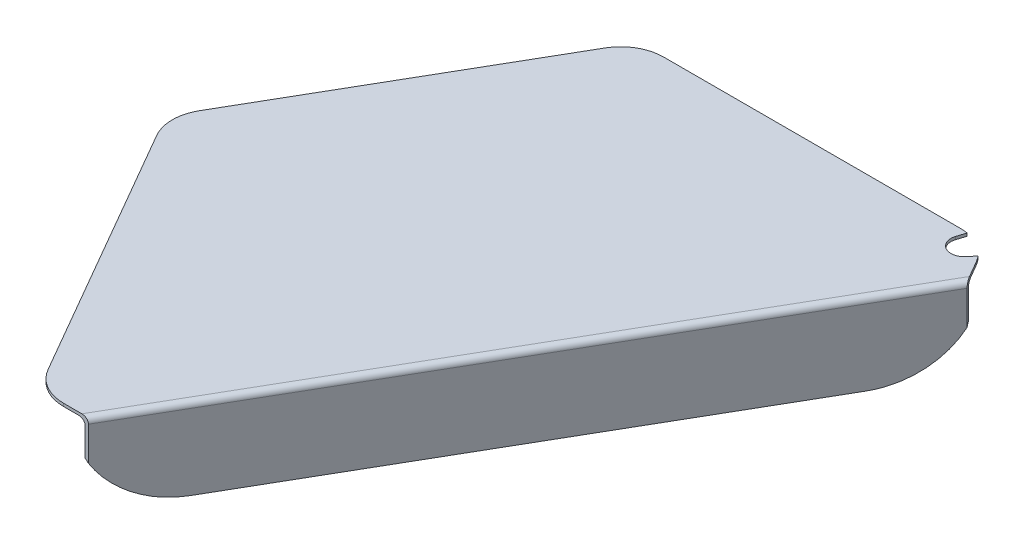
ISO-10303-21;
HEADER;
FILE_DESCRIPTION(('STEP AP214'),'2;1');
FILE_NAME('part.step','',(''),(''),'','','');
FILE_SCHEMA(('AUTOMOTIVE_DESIGN { 1 0 10303 214 1 1 1 1 }'));
ENDSEC;
DATA;
#1=APPLICATION_CONTEXT('core data for automotive mechanical design processes');
#2=APPLICATION_PROTOCOL_DEFINITION('international standard','automotive_design',2000,#1);
#3=PRODUCT_CONTEXT('',#1,'mechanical');
#4=PRODUCT('Part','Part','',(#3));
#5=PRODUCT_RELATED_PRODUCT_CATEGORY('part','',(#4));
#6=PRODUCT_DEFINITION_FORMATION('','',#4);
#7=PRODUCT_DEFINITION_CONTEXT('part definition',#1,'design');
#8=PRODUCT_DEFINITION('design','',#6,#7);
#9=PRODUCT_DEFINITION_SHAPE('','',#8);
#10=(LENGTH_UNIT() NAMED_UNIT(*) SI_UNIT(.MILLI.,.METRE.));
#11=(NAMED_UNIT(*) PLANE_ANGLE_UNIT() SI_UNIT($,.RADIAN.));
#12=(NAMED_UNIT(*) SI_UNIT($,.STERADIAN.) SOLID_ANGLE_UNIT());
#13=UNCERTAINTY_MEASURE_WITH_UNIT(LENGTH_MEASURE(1.E-05),#10,'distance_accuracy_value','');
#14=(GEOMETRIC_REPRESENTATION_CONTEXT(3) GLOBAL_UNCERTAINTY_ASSIGNED_CONTEXT((#13)) GLOBAL_UNIT_ASSIGNED_CONTEXT((#10,
#11,#12)) REPRESENTATION_CONTEXT('',''));
#15=CARTESIAN_POINT('',(0.,0.,0.));
#16=DIRECTION('',(0.,0.,1.));
#17=DIRECTION('',(1.,0.,0.));
#18=AXIS2_PLACEMENT_3D('',#15,#16,#17);
#19=CARTESIAN_POINT('',(14.9387078959027,1.,8.62486702504461));
#20=DIRECTION('',(0.866025403784439,0.,0.5));
#21=DIRECTION('',(0.5,0.,-0.866025403784439));
#22=AXIS2_PLACEMENT_3D('',#19,#20,#21);
#23=PLANE('',#22);
#24=CARTESIAN_POINT('',(-28.4771738330698,2.57790699895552,83.8233800350263));
#25=DIRECTION('',(-0.866025403784439,0.,-0.5));
#26=DIRECTION('',(0.5,0.,-0.866025403784439));
#27=AXIS2_PLACEMENT_3D('',#24,#25,#26);
#28=ELLIPSE('',#27,30.3108891324553,30.);
#29=CARTESIAN_POINT('',(-28.4771738330698,-27.4220930010445,83.8233800350263));
#30=VERTEX_POINT('',#29);
#31=CARTESIAN_POINT('',(-41.4675548898364,-12.8744556101758,106.323380035026));
#32=VERTEX_POINT('',#31);
#33=EDGE_CURVE('E179',#30,#32,#28,.T.);
#34=ORIENTED_EDGE('',*,*,#33,.F.);
#35=DIRECTION('',(-0.5,0.,0.866025403784439));
#36=VECTOR('',#35,1.);
#37=CARTESIAN_POINT('',(58.1253665453741,-27.4220930010445,-66.1766199649737));
#38=LINE('',#37,#36);
#39=CARTESIAN_POINT('',(58.1253665453741,-27.4220930010445,-66.1766199649737));
#40=VERTEX_POINT('',#39);
#41=EDGE_CURVE('E174',#40,#30,#38,.T.);
#42=ORIENTED_EDGE('',*,*,#41,.F.);
#43=CARTESIAN_POINT('',(58.125366545374,2.57790699895552,-66.1766199649737));
#44=DIRECTION('',(-0.866025403784439,0.,-0.5));
#45=DIRECTION('',(-0.5,0.,0.866025403784439));
#46=AXIS2_PLACEMENT_3D('',#43,#44,#45);
#47=ELLIPSE('',#46,30.3108891324553,30.);
#48=CARTESIAN_POINT('',(71.1157476021406,-12.8744556101757,-88.6766199649738));
#49=VERTEX_POINT('',#48);
#50=EDGE_CURVE('E182',#49,#40,#47,.T.);
#51=ORIENTED_EDGE('',*,*,#50,.F.);
#52=DIRECTION('',(0.,-1.,0.));
#53=VECTOR('',#52,1.);
#54=CARTESIAN_POINT('',(71.1157476021407,1.,-88.6766199649737));
#55=LINE('',#54,#53);
#56=CARTESIAN_POINT('',(71.1157476021407,-1.,-88.6766199649737));
#57=VERTEX_POINT('',#56);
#58=EDGE_CURVE('E313',#57,#49,#55,.T.);
#59=ORIENTED_EDGE('',*,*,#58,.F.);
#60=DIRECTION('',(-0.5,0.,0.866025403784439));
#61=VECTOR('',#60,1.);
#62=CARTESIAN_POINT('',(14.9387078959027,-1.,8.62486702504461));
#63=LINE('',#62,#61);
#64=CARTESIAN_POINT('',(-41.4675548898364,-1.,106.323380035026));
#65=VERTEX_POINT('',#64);
#66=EDGE_CURVE('E293',#57,#65,#63,.T.);
#67=ORIENTED_EDGE('',*,*,#66,.T.);
#68=DIRECTION('',(0.,-1.,0.));
#69=VECTOR('',#68,1.);
#70=CARTESIAN_POINT('',(-41.4675548898364,1.,106.323380035026));
#71=LINE('',#70,#69);
#72=EDGE_CURVE('E314',#65,#32,#71,.T.);
#73=ORIENTED_EDGE('',*,*,#72,.T.);
#74=EDGE_LOOP('',(#34,#42,#51,#59,#67,#73));
#75=FACE_BOUND('',#74,.T.);
#76=ADVANCED_FACE('F35',(#75),#23,.T.);
#77=CARTESIAN_POINT('',(14.0726824921183,-27.5,8.12486702504465));
#78=DIRECTION('',(0.866025403784439,0.,0.5));
#79=DIRECTION('',(0.5,0.,-0.866025403784439));
#80=AXIS2_PLACEMENT_3D('',#77,#78,#79);
#81=PLANE('',#80);
#82=DIRECTION('',(-0.5,0.,0.866025403784439));
#83=VECTOR('',#82,1.);
#84=CARTESIAN_POINT('',(14.0726824921183,-27.4220930010445,8.12486702504465));
#85=LINE('',#84,#83);
#86=CARTESIAN_POINT('',(57.2593411415897,-27.4220930010445,-66.6766199649737));
#87=VERTEX_POINT('',#86);
#88=CARTESIAN_POINT('',(-29.3431992368542,-27.4220930010445,83.3233800350263));
#89=VERTEX_POINT('',#88);
#90=EDGE_CURVE('E43',#87,#89,#85,.T.);
#91=ORIENTED_EDGE('',*,*,#90,.T.);
#92=CARTESIAN_POINT('',(-29.3431992368542,2.57790699895552,83.3233800350263));
#93=DIRECTION('',(-0.866025403784439,0.,-0.5));
#94=DIRECTION('',(0.5,0.,-0.866025403784439));
#95=AXIS2_PLACEMENT_3D('',#92,#93,#94);
#96=ELLIPSE('',#95,30.3108891324553,30.);
#97=CARTESIAN_POINT('',(-42.6222554282156,-11.8810426340501,106.323380035026));
#98=VERTEX_POINT('',#97);
#99=EDGE_CURVE('E11',#89,#98,#96,.T.);
#100=ORIENTED_EDGE('',*,*,#99,.T.);
#101=DIRECTION('',(0.,1.,0.));
#102=VECTOR('',#101,1.);
#103=CARTESIAN_POINT('',(-42.6222554282156,-27.5,106.323380035026));
#104=LINE('',#103,#102);
#105=CARTESIAN_POINT('',(-42.6222554282156,-2.,106.323380035026));
#106=VERTEX_POINT('',#105);
#107=EDGE_CURVE('E368',#98,#106,#104,.T.);
#108=ORIENTED_EDGE('',*,*,#107,.T.);
#109=DIRECTION('',(0.5,0.,-0.866025403784439));
#110=VECTOR('',#109,1.);
#111=CARTESIAN_POINT('',(70.5383973329511,-2.,-89.6766199649736));
#112=LINE('',#111,#110);
#113=CARTESIAN_POINT('',(70.5383973329511,-2.,-89.6766199649736));
#114=VERTEX_POINT('',#113);
#115=EDGE_CURVE('E295',#106,#114,#112,.T.);
#116=ORIENTED_EDGE('',*,*,#115,.T.);
#117=DIRECTION('',(0.,1.,0.));
#118=VECTOR('',#117,1.);
#119=CARTESIAN_POINT('',(70.5383973329511,-27.5,-89.6766199649736));
#120=LINE('',#119,#118);
#121=CARTESIAN_POINT('',(70.5383973329511,-11.8810426340502,-89.6766199649736));
#122=VERTEX_POINT('',#121);
#123=EDGE_CURVE('E312',#122,#114,#120,.T.);
#124=ORIENTED_EDGE('',*,*,#123,.F.);
#125=CARTESIAN_POINT('',(57.2593411415897,2.57790699895552,-66.6766199649737));
#126=DIRECTION('',(-0.866025403784439,0.,-0.5));
#127=DIRECTION('',(-0.5,0.,0.866025403784439));
#128=AXIS2_PLACEMENT_3D('',#125,#126,#127);
#129=ELLIPSE('',#128,30.3108891324553,30.);
#130=EDGE_CURVE('E309',#122,#87,#129,.T.);
#131=ORIENTED_EDGE('',*,*,#130,.T.);
#132=EDGE_LOOP('',(#91,#100,#108,#116,#124,#131));
#133=FACE_BOUND('',#132,.T.);
#134=ADVANCED_FACE('F221',(#133),#81,.F.);
#135=CARTESIAN_POINT('',(0.,0.,0.));
#136=DIRECTION('',(0.,1.,0.));
#137=DIRECTION('',(0.,0.,1.));
#138=AXIS2_PLACEMENT_3D('',#135,#136,#137);
#139=PLANE('',#138);
#140=DIRECTION('',(-0.499999999999998,0.,-0.86602540378444));
#141=VECTOR('',#140,1.);
#142=CARTESIAN_POINT('',(91.7349135073083,0.,-52.9631770075312));
#143=LINE('',#142,#141);
#144=CARTESIAN_POINT('',(69.3836967945718,0.,-91.6766199649737));
#145=VERTEX_POINT('',#144);
#146=CARTESIAN_POINT('',(66.7856205832185,0.,-96.1766199649737));
#147=VERTEX_POINT('',#146);
#148=EDGE_CURVE('E394',#145,#147,#143,.T.);
#149=ORIENTED_EDGE('',*,*,#148,.F.);
#150=DIRECTION('',(0.5,0.,-0.866025403784439));
#151=VECTOR('',#150,1.);
#152=CARTESIAN_POINT('',(-44.3543062357845,0.,105.323380035026));
#153=LINE('',#152,#151);
#154=CARTESIAN_POINT('',(-44.9316565049741,0.,106.323380035026));
#155=VERTEX_POINT('',#154);
#156=EDGE_CURVE('E298',#145,#155,#153,.F.);
#157=ORIENTED_EDGE('',*,*,#156,.T.);
#158=DIRECTION('',(-1.,0.,0.));
#159=VECTOR('',#158,1.);
#160=CARTESIAN_POINT('',(-3.40759820829226E-13,0.,106.323380035026));
#161=LINE('',#160,#159);
#162=CARTESIAN_POINT('',(-50.1278089276807,0.,106.323380035026));
#163=VERTEX_POINT('',#162);
#164=EDGE_CURVE('E392',#155,#163,#161,.T.);
#165=ORIENTED_EDGE('',*,*,#164,.T.);
#166=CARTESIAN_POINT('',(-50.1278089276807,0.,91.3233800350263));
#167=DIRECTION('',(0.,1.,0.));
#168=DIRECTION('',(0.,0.,1.));
#169=AXIS2_PLACEMENT_3D('',#166,#167,#168);
#170=CIRCLE('',#169,15.);
#171=CARTESIAN_POINT('',(-63.1181899844473,0.,98.8233800350262));
#172=VERTEX_POINT('',#171);
#173=EDGE_CURVE('E389',#172,#163,#170,.T.);
#174=ORIENTED_EDGE('',*,*,#173,.F.);
#175=DIRECTION('',(-0.5,0.,-0.866025403784439));
#176=VECTOR('',#175,1.);
#177=CARTESIAN_POINT('',(-90.1304212874238,0.,52.0368229924685));
#178=LINE('',#177,#176);
#179=CARTESIAN_POINT('',(-115.079714211514,0.,8.82338003502639));
#180=VERTEX_POINT('',#179);
#181=EDGE_CURVE('E386',#172,#180,#178,.T.);
#182=ORIENTED_EDGE('',*,*,#181,.T.);
#183=CARTESIAN_POINT('',(-102.089333154747,0.,1.32338003502633));
#184=DIRECTION('',(0.,1.,0.));
#185=DIRECTION('',(0.,0.,1.));
#186=AXIS2_PLACEMENT_3D('',#183,#184,#185);
#187=CIRCLE('',#186,15.);
#188=CARTESIAN_POINT('',(-115.079714211514,0.,-6.17661996497375));
#189=VERTEX_POINT('',#188);
#190=EDGE_CURVE('E383',#189,#180,#187,.T.);
#191=ORIENTED_EDGE('',*,*,#190,.F.);
#192=DIRECTION('',(0.5,0.,-0.866025403784439));
#193=VECTOR('',#192,1.);
#194=CARTESIAN_POINT('',(-88.9843405582299,0.,-51.3751329749554));
#195=LINE('',#194,#193);
#196=CARTESIAN_POINT('',(-63.1181899844474,0.,-96.1766199649736));
#197=VERTEX_POINT('',#196);
#198=EDGE_CURVE('E380',#189,#197,#195,.T.);
#199=ORIENTED_EDGE('',*,*,#198,.T.);
#200=CARTESIAN_POINT('',(-50.1278089276807,0.,-88.6766199649737));
#201=DIRECTION('',(0.,1.,0.));
#202=DIRECTION('',(0.,0.,1.));
#203=AXIS2_PLACEMENT_3D('',#200,#201,#202);
#204=CIRCLE('',#203,15.);
#205=CARTESIAN_POINT('',(-50.1278089276806,0.,-103.676619964974));
#206=VERTEX_POINT('',#205);
#207=EDGE_CURVE('E377',#206,#197,#204,.T.);
#208=ORIENTED_EDGE('',*,*,#207,.F.);
#209=DIRECTION('',(1.,0.,0.));
#210=VECTOR('',#209,1.);
#211=CARTESIAN_POINT('',(0.,0.,-103.676619964974));
#212=LINE('',#211,#210);
#213=CARTESIAN_POINT('',(53.7952395264518,0.,-103.676619964974));
#214=VERTEX_POINT('',#213);
#215=EDGE_CURVE('E374',#206,#214,#212,.T.);
#216=ORIENTED_EDGE('',*,*,#215,.T.);
#217=CARTESIAN_POINT('',(53.7952395264519,0.,-88.6766199649737));
#218=DIRECTION('',(0.,1.,0.));
#219=DIRECTION('',(0.,0.,1.));
#220=AXIS2_PLACEMENT_3D('',#217,#218,#219);
#221=CIRCLE('',#220,15.);
#222=CARTESIAN_POINT('',(56.3584015291872,0.,-103.456004273792));
#223=VERTEX_POINT('',#222);
#224=EDGE_CURVE('E371',#223,#214,#221,.T.);
#225=ORIENTED_EDGE('',*,*,#224,.F.);
#226=DIRECTION('',(-0.306743268264024,0.,0.951792292138734));
#227=VECTOR('',#226,1.);
#228=CARTESIAN_POINT('',(20.8509701854141,0.,6.71984296781569));
#229=LINE('',#228,#227);
#230=CARTESIAN_POINT('',(55.3768924535536,0.,-100.410484226557));
#231=VERTEX_POINT('',#230);
#232=EDGE_CURVE('E367',#223,#231,#229,.T.);
#233=ORIENTED_EDGE('',*,*,#232,.T.);
#234=CARTESIAN_POINT('',(59.7551369973918,0.,-98.9994651925429));
#235=DIRECTION('',(0.,1.,0.));
#236=DIRECTION('',(0.,0.,1.));
#237=AXIS2_PLACEMENT_3D('',#234,#235,#236);
#238=CIRCLE('',#237,4.60000000000001);
#239=CARTESIAN_POINT('',(63.4142519508294,0.,-96.2118357771562));
#240=VERTEX_POINT('',#239);
#241=EDGE_CURVE('E364',#231,#240,#238,.T.);
#242=ORIENTED_EDGE('',*,*,#241,.T.);
#243=DIRECTION('',(0.646175348146152,0.,-0.763188980166905));
#244=VECTOR('',#243,1.);
#245=CARTESIAN_POINT('',(-10.5111409694199,0.,-8.89955221030941));
#246=LINE('',#245,#244);
#247=CARTESIAN_POINT('',(65.2419807269817,0.,-98.370541559875));
#248=VERTEX_POINT('',#247);
#249=EDGE_CURVE('E399',#240,#248,#246,.T.);
#250=ORIENTED_EDGE('',*,*,#249,.T.);
#251=CARTESIAN_POINT('',(53.7952395264519,0.,-88.6766199649737));
#252=DIRECTION('',(0.,1.,0.));
#253=DIRECTION('',(0.,0.,1.));
#254=AXIS2_PLACEMENT_3D('',#251,#252,#253);
#255=CIRCLE('',#254,15.);
#256=EDGE_CURVE('E396',#147,#248,#255,.T.);
#257=ORIENTED_EDGE('',*,*,#256,.F.);
#258=EDGE_LOOP('',(#149,#157,#165,#174,#182,#191,#199,#208,#216,#225,#233,#242,#250,#257));
#259=FACE_BOUND('',#258,.T.);
#260=ADVANCED_FACE('F234',(#259),#139,.F.);
#261=CARTESIAN_POINT('',(59.7551369973918,1.,-98.9994651925429));
#262=DIRECTION('',(0.,-1.,0.));
#263=DIRECTION('',(0.,0.,-1.));
#264=AXIS2_PLACEMENT_3D('',#261,#262,#263);
#265=CYLINDRICAL_SURFACE('',#264,4.60000000000001);
#266=ORIENTED_EDGE('',*,*,#241,.F.);
#267=DIRECTION('',(0.,-1.,0.));
#268=VECTOR('',#267,1.);
#269=CARTESIAN_POINT('',(55.3768924535536,1.,-100.410484226557));
#270=LINE('',#269,#268);
#271=CARTESIAN_POINT('',(55.3768924535536,1.,-100.410484226557));
#272=VERTEX_POINT('',#271);
#273=EDGE_CURVE('E340',#272,#231,#270,.T.);
#274=ORIENTED_EDGE('',*,*,#273,.F.);
#275=CARTESIAN_POINT('',(59.7551369973918,1.,-98.9994651925429));
#276=DIRECTION('',(0.,1.,0.));
#277=DIRECTION('',(0.,0.,1.));
#278=AXIS2_PLACEMENT_3D('',#275,#276,#277);
#279=CIRCLE('',#278,4.60000000000001);
#280=CARTESIAN_POINT('',(63.4142519508294,1.,-96.2118357771562));
#281=VERTEX_POINT('',#280);
#282=EDGE_CURVE('E402',#272,#281,#279,.T.);
#283=ORIENTED_EDGE('',*,*,#282,.T.);
#284=DIRECTION('',(0.,-1.,0.));
#285=VECTOR('',#284,1.);
#286=CARTESIAN_POINT('',(63.4142519508294,1.,-96.2118357771562));
#287=LINE('',#286,#285);
#288=EDGE_CURVE('E363',#281,#240,#287,.T.);
#289=ORIENTED_EDGE('',*,*,#288,.T.);
#290=EDGE_LOOP('',(#266,#274,#283,#289));
#291=FACE_BOUND('',#290,.T.);
#292=ADVANCED_FACE('F272',(#291),#265,.F.);
#293=CARTESIAN_POINT('',(20.8509701854141,1.,6.71984296781569));
#294=DIRECTION('',(0.951792292138734,0.,0.306743268264024));
#295=DIRECTION('',(0.306743268264024,0.,-0.951792292138734));
#296=AXIS2_PLACEMENT_3D('',#293,#294,#295);
#297=PLANE('',#296);
#298=ORIENTED_EDGE('',*,*,#232,.F.);
#299=DIRECTION('',(0.,-1.,0.));
#300=VECTOR('',#299,1.);
#301=CARTESIAN_POINT('',(56.3584015291872,1.,-103.456004273792));
#302=LINE('',#301,#300);
#303=CARTESIAN_POINT('',(56.3584015291872,1.,-103.456004273792));
#304=VERTEX_POINT('',#303);
#305=EDGE_CURVE('E338',#304,#223,#302,.T.);
#306=ORIENTED_EDGE('',*,*,#305,.F.);
#307=DIRECTION('',(-0.306743268264024,0.,0.951792292138734));
#308=VECTOR('',#307,1.);
#309=CARTESIAN_POINT('',(20.8509701854141,1.,6.71984296781569));
#310=LINE('',#309,#308);
#311=EDGE_CURVE('E420',#304,#272,#310,.T.);
#312=ORIENTED_EDGE('',*,*,#311,.T.);
#313=ORIENTED_EDGE('',*,*,#273,.T.);
#314=EDGE_LOOP('',(#298,#306,#312,#313));
#315=FACE_BOUND('',#314,.T.);
#316=ADVANCED_FACE('F268',(#315),#297,.T.);
#317=CARTESIAN_POINT('',(53.7952395264519,1.,-88.6766199649737));
#318=DIRECTION('',(0.,-1.,0.));
#319=DIRECTION('',(0.,0.,-1.));
#320=AXIS2_PLACEMENT_3D('',#317,#318,#319);
#321=CYLINDRICAL_SURFACE('',#320,15.);
#322=ORIENTED_EDGE('',*,*,#224,.T.);
#323=DIRECTION('',(0.,-1.,0.));
#324=VECTOR('',#323,1.);
#325=CARTESIAN_POINT('',(53.7952395264518,1.,-103.676619964974));
#326=LINE('',#325,#324);
#327=CARTESIAN_POINT('',(53.7952395264518,1.,-103.676619964974));
#328=VERTEX_POINT('',#327);
#329=EDGE_CURVE('E336',#328,#214,#326,.T.);
#330=ORIENTED_EDGE('',*,*,#329,.F.);
#331=CARTESIAN_POINT('',(53.7952395264519,1.,-88.6766199649737));
#332=DIRECTION('',(0.,1.,0.));
#333=DIRECTION('',(0.,0.,1.));
#334=AXIS2_PLACEMENT_3D('',#331,#332,#333);
#335=CIRCLE('',#334,15.);
#336=EDGE_CURVE('E445',#304,#328,#335,.T.);
#337=ORIENTED_EDGE('',*,*,#336,.F.);
#338=ORIENTED_EDGE('',*,*,#305,.T.);
#339=EDGE_LOOP('',(#322,#330,#337,#338));
#340=FACE_BOUND('',#339,.T.);
#341=ADVANCED_FACE('F264',(#340),#321,.T.);
#342=CARTESIAN_POINT('',(0.,1.,-103.676619964974));
#343=DIRECTION('',(0.,0.,-1.));
#344=DIRECTION('',(-1.,0.,0.));
#345=AXIS2_PLACEMENT_3D('',#342,#343,#344);
#346=PLANE('',#345);
#347=ORIENTED_EDGE('',*,*,#215,.F.);
#348=DIRECTION('',(0.,-1.,0.));
#349=VECTOR('',#348,1.);
#350=CARTESIAN_POINT('',(-50.1278089276806,1.,-103.676619964974));
#351=LINE('',#350,#349);
#352=CARTESIAN_POINT('',(-50.1278089276806,1.,-103.676619964974));
#353=VERTEX_POINT('',#352);
#354=EDGE_CURVE('E334',#353,#206,#351,.T.);
#355=ORIENTED_EDGE('',*,*,#354,.F.);
#356=DIRECTION('',(1.,0.,0.));
#357=VECTOR('',#356,1.);
#358=CARTESIAN_POINT('',(0.,1.,-103.676619964974));
#359=LINE('',#358,#357);
#360=EDGE_CURVE('E443',#353,#328,#359,.T.);
#361=ORIENTED_EDGE('',*,*,#360,.T.);
#362=ORIENTED_EDGE('',*,*,#329,.T.);
#363=EDGE_LOOP('',(#347,#355,#361,#362));
#364=FACE_BOUND('',#363,.T.);
#365=ADVANCED_FACE('F260',(#364),#346,.T.);
#366=CARTESIAN_POINT('',(-50.1278089276807,1.,-88.6766199649737));
#367=DIRECTION('',(0.,-1.,0.));
#368=DIRECTION('',(0.,0.,-1.));
#369=AXIS2_PLACEMENT_3D('',#366,#367,#368);
#370=CYLINDRICAL_SURFACE('',#369,15.);
#371=ORIENTED_EDGE('',*,*,#207,.T.);
#372=DIRECTION('',(0.,-1.,0.));
#373=VECTOR('',#372,1.);
#374=CARTESIAN_POINT('',(-63.1181899844474,1.,-96.1766199649736));
#375=LINE('',#374,#373);
#376=CARTESIAN_POINT('',(-63.1181899844474,1.,-96.1766199649736));
#377=VERTEX_POINT('',#376);
#378=EDGE_CURVE('E332',#377,#197,#375,.T.);
#379=ORIENTED_EDGE('',*,*,#378,.F.);
#380=CARTESIAN_POINT('',(-50.1278089276807,1.,-88.6766199649737));
#381=DIRECTION('',(0.,1.,0.));
#382=DIRECTION('',(0.,0.,1.));
#383=AXIS2_PLACEMENT_3D('',#380,#381,#382);
#384=CIRCLE('',#383,15.);
#385=EDGE_CURVE('E451',#353,#377,#384,.T.);
#386=ORIENTED_EDGE('',*,*,#385,.F.);
#387=ORIENTED_EDGE('',*,*,#354,.T.);
#388=EDGE_LOOP('',(#371,#379,#386,#387));
#389=FACE_BOUND('',#388,.T.);
#390=ADVANCED_FACE('F256',(#389),#370,.T.);
#391=CARTESIAN_POINT('',(-88.9843405582299,1.,-51.3751329749554));
#392=DIRECTION('',(-0.866025403784439,0.,-0.5));
#393=DIRECTION('',(-0.5,0.,0.866025403784439));
#394=AXIS2_PLACEMENT_3D('',#391,#392,#393);
#395=PLANE('',#394);
#396=ORIENTED_EDGE('',*,*,#198,.F.);
#397=DIRECTION('',(0.,-1.,0.));
#398=VECTOR('',#397,1.);
#399=CARTESIAN_POINT('',(-115.079714211514,1.,-6.17661996497375));
#400=LINE('',#399,#398);
#401=CARTESIAN_POINT('',(-115.079714211514,1.,-6.17661996497375));
#402=VERTEX_POINT('',#401);
#403=EDGE_CURVE('E330',#402,#189,#400,.T.);
#404=ORIENTED_EDGE('',*,*,#403,.F.);
#405=DIRECTION('',(0.5,0.,-0.866025403784439));
#406=VECTOR('',#405,1.);
#407=CARTESIAN_POINT('',(-88.9843405582299,1.,-51.3751329749554));
#408=LINE('',#407,#406);
#409=EDGE_CURVE('E437',#402,#377,#408,.T.);
#410=ORIENTED_EDGE('',*,*,#409,.T.);
#411=ORIENTED_EDGE('',*,*,#378,.T.);
#412=EDGE_LOOP('',(#396,#404,#410,#411));
#413=FACE_BOUND('',#412,.T.);
#414=ADVANCED_FACE('F252',(#413),#395,.T.);
#415=CARTESIAN_POINT('',(-102.089333154747,1.,1.32338003502633));
#416=DIRECTION('',(0.,-1.,0.));
#417=DIRECTION('',(0.,0.,-1.));
#418=AXIS2_PLACEMENT_3D('',#415,#416,#417);
#419=CYLINDRICAL_SURFACE('',#418,15.);
#420=ORIENTED_EDGE('',*,*,#190,.T.);
#421=DIRECTION('',(0.,-1.,0.));
#422=VECTOR('',#421,1.);
#423=CARTESIAN_POINT('',(-115.079714211514,1.,8.82338003502639));
#424=LINE('',#423,#422);
#425=CARTESIAN_POINT('',(-115.079714211514,1.,8.82338003502639));
#426=VERTEX_POINT('',#425);
#427=EDGE_CURVE('E328',#426,#180,#424,.T.);
#428=ORIENTED_EDGE('',*,*,#427,.F.);
#429=CARTESIAN_POINT('',(-102.089333154747,1.,1.32338003502633));
#430=DIRECTION('',(0.,1.,0.));
#431=DIRECTION('',(0.,0.,1.));
#432=AXIS2_PLACEMENT_3D('',#429,#430,#431);
#433=CIRCLE('',#432,15.);
#434=EDGE_CURVE('E454',#402,#426,#433,.T.);
#435=ORIENTED_EDGE('',*,*,#434,.F.);
#436=ORIENTED_EDGE('',*,*,#403,.T.);
#437=EDGE_LOOP('',(#420,#428,#435,#436));
#438=FACE_BOUND('',#437,.T.);
#439=ADVANCED_FACE('F248',(#438),#419,.T.);
#440=CARTESIAN_POINT('',(-90.1304212874238,1.,52.0368229924685));
#441=DIRECTION('',(-0.866025403784439,0.,0.5));
#442=DIRECTION('',(0.5,0.,0.866025403784439));
#443=AXIS2_PLACEMENT_3D('',#440,#441,#442);
#444=PLANE('',#443);
#445=ORIENTED_EDGE('',*,*,#181,.F.);
#446=DIRECTION('',(0.,-1.,0.));
#447=VECTOR('',#446,1.);
#448=CARTESIAN_POINT('',(-63.1181899844473,1.,98.8233800350262));
#449=LINE('',#448,#447);
#450=CARTESIAN_POINT('',(-63.1181899844473,1.,98.8233800350262));
#451=VERTEX_POINT('',#450);
#452=EDGE_CURVE('E326',#451,#172,#449,.T.);
#453=ORIENTED_EDGE('',*,*,#452,.F.);
#454=DIRECTION('',(-0.5,0.,-0.866025403784439));
#455=VECTOR('',#454,1.);
#456=CARTESIAN_POINT('',(-90.1304212874238,1.,52.0368229924685));
#457=LINE('',#456,#455);
#458=EDGE_CURVE('E355',#451,#426,#457,.T.);
#459=ORIENTED_EDGE('',*,*,#458,.T.);
#460=ORIENTED_EDGE('',*,*,#427,.T.);
#461=EDGE_LOOP('',(#445,#453,#459,#460));
#462=FACE_BOUND('',#461,.T.);
#463=ADVANCED_FACE('F244',(#462),#444,.T.);
#464=CARTESIAN_POINT('',(-50.1278089276807,1.,91.3233800350263));
#465=DIRECTION('',(0.,-1.,0.));
#466=DIRECTION('',(0.,0.,-1.));
#467=AXIS2_PLACEMENT_3D('',#464,#465,#466);
#468=CYLINDRICAL_SURFACE('',#467,15.);
#469=ORIENTED_EDGE('',*,*,#173,.T.);
#470=DIRECTION('',(0.,-1.,0.));
#471=VECTOR('',#470,1.);
#472=CARTESIAN_POINT('',(-50.1278089276807,1.,106.323380035026));
#473=LINE('',#472,#471);
#474=CARTESIAN_POINT('',(-50.1278089276807,1.,106.323380035026));
#475=VERTEX_POINT('',#474);
#476=EDGE_CURVE('E317',#475,#163,#473,.T.);
#477=ORIENTED_EDGE('',*,*,#476,.F.);
#478=CARTESIAN_POINT('',(-50.1278089276807,1.,91.3233800350263));
#479=DIRECTION('',(0.,1.,0.));
#480=DIRECTION('',(0.,0.,1.));
#481=AXIS2_PLACEMENT_3D('',#478,#479,#480);
#482=CIRCLE('',#481,15.);
#483=EDGE_CURVE('E349',#451,#475,#482,.T.);
#484=ORIENTED_EDGE('',*,*,#483,.F.);
#485=ORIENTED_EDGE('',*,*,#452,.T.);
#486=EDGE_LOOP('',(#469,#477,#484,#485));
#487=FACE_BOUND('',#486,.T.);
#488=ADVANCED_FACE('F240',(#487),#468,.T.);
#489=CARTESIAN_POINT('',(-3.40759820829226E-13,1.,106.323380035026));
#490=DIRECTION('',(0.,0.,1.));
#491=DIRECTION('',(1.,0.,0.));
#492=AXIS2_PLACEMENT_3D('',#489,#490,#491);
#493=PLANE('',#492);
#494=CARTESIAN_POINT('',(-41.4675548898364,-12.8744556101758,106.323380035026));
#495=CARTESIAN_POINT('',(-41.5909436638115,-12.7728425027459,106.323380035026));
#496=CARTESIAN_POINT('',(-41.7136640831995,-12.670416444895,106.323380035026));
#497=CARTESIAN_POINT('',(-41.9576027947693,-12.464001133313,106.323380035026));
#498=CARTESIAN_POINT('',(-42.0788222826722,-12.3600132924891,106.323380035026));
#499=CARTESIAN_POINT('',(-42.3197239870312,-12.1504338641998,106.323380035026));
#500=CARTESIAN_POINT('',(-42.4394071837448,-12.044843403888,106.323380035026));
#501=CARTESIAN_POINT('',(-42.6771980856443,-11.8320156259822,106.323380035026));
#502=CARTESIAN_POINT('',(-42.7953065131628,-11.7247791156378,106.323380035026));
#503=CARTESIAN_POINT('',(-43.0299074404591,-11.5086133392108,106.323380035026));
#504=CARTESIAN_POINT('',(-43.1464003540899,-11.3996845224017,106.323380035026));
#505=CARTESIAN_POINT('',(-43.3777423593454,-11.1800707254097,106.323380035026));
#506=CARTESIAN_POINT('',(-43.4925912789386,-11.0693855639573,106.323380035026));
#507=CARTESIAN_POINT('',(-43.7205802625161,-10.8462241006085,106.323380035026));
#508=CARTESIAN_POINT('',(-43.8337199865188,-10.7337474512691,106.323380035026));
#509=CARTESIAN_POINT('',(-44.0582374944218,-10.506951368749,106.323380035026));
#510=CARTESIAN_POINT('',(-44.1696144870536,-10.3926311520376,106.323380035026));
#511=CARTESIAN_POINT('',(-44.3905503125849,-10.1620927924925,106.323380035026));
#512=CARTESIAN_POINT('',(-44.5001078189228,-10.0458733777654,106.323380035026));
#513=CARTESIAN_POINT('',(-44.717343532475,-9.81147818274895,106.323380035026));
#514=CARTESIAN_POINT('',(-44.8250197779022,-9.69330058458651,106.323380035026));
#515=CARTESIAN_POINT('',(-44.9316565049741,-9.57419032569399,106.323380035026));
#516=B_SPLINE_CURVE_WITH_KNOTS('',3,(#494,#495,#496,#497,#498,#499,#500,#501,#502,#503,#504,
#505,#506,#507,#508,#509,#510,#511,#512,#513,#514,#515),.UNSPECIFIED.,.F.,.F.,(4,2,2,2,2,2,2,2,
2,2,4),(0.,0.479528959567975,0.958647508452173,1.43744340910346,1.91601156145012,
2.39445476391931,2.87294767113911,3.35153453592694,3.83033046465839,4.30946137474963,
4.78906523077738),.UNSPECIFIED.);
#517=EDGE_CURVE('E203',#32,#98,#516,.T.);
#518=ORIENTED_EDGE('',*,*,#517,.F.);
#519=ORIENTED_EDGE('',*,*,#72,.F.);
#520=CARTESIAN_POINT('',(-43.7769559665949,-1.,106.323380035026));
#521=DIRECTION('',(0.,0.,1.));
#522=DIRECTION('',(-1.,0.,0.));
#523=AXIS2_PLACEMENT_3D('',#520,#521,#522);
#524=ELLIPSE('',#523,2.3094010767585,2.);
#525=CARTESIAN_POINT('',(-43.7769559665949,1.,106.323380035026));
#526=VERTEX_POINT('',#525);
#527=EDGE_CURVE('E300',#65,#526,#524,.T.);
#528=ORIENTED_EDGE('',*,*,#527,.T.);
#529=DIRECTION('',(-1.,0.,0.));
#530=VECTOR('',#529,1.);
#531=CARTESIAN_POINT('',(-3.40759820829226E-13,1.,106.323380035026));
#532=LINE('',#531,#530);
#533=EDGE_CURVE('E345',#526,#475,#532,.T.);
#534=ORIENTED_EDGE('',*,*,#533,.T.);
#535=ORIENTED_EDGE('',*,*,#476,.T.);
#536=ORIENTED_EDGE('',*,*,#164,.F.);
#537=CARTESIAN_POINT('',(-44.9316565049741,-2.,106.323380035026));
#538=DIRECTION('',(0.,0.,1.));
#539=DIRECTION('',(-1.,0.,0.));
#540=AXIS2_PLACEMENT_3D('',#537,#538,#539);
#541=ELLIPSE('',#540,2.3094010767585,2.);
#542=EDGE_CURVE('E306',#155,#106,#541,.F.);
#543=ORIENTED_EDGE('',*,*,#542,.T.);
#544=ORIENTED_EDGE('',*,*,#107,.F.);
#545=EDGE_LOOP('',(#518,#519,#528,#534,#535,#536,#543,#544));
#546=FACE_BOUND('',#545,.T.);
#547=ADVANCED_FACE('F236',(#546),#493,.T.);
#548=CARTESIAN_POINT('',(91.7349135073083,1.,-52.9631770075312));
#549=DIRECTION('',(-0.86602540378444,0.,0.499999999999998));
#550=DIRECTION('',(0.499999999999998,0.,0.86602540378444));
#551=AXIS2_PLACEMENT_3D('',#548,#549,#550);
#552=PLANE('',#551);
#553=ORIENTED_EDGE('',*,*,#58,.T.);
#554=CARTESIAN_POINT('',(71.1157476021407,-12.8744556101758,-88.6766199649737));
#555=CARTESIAN_POINT('',(71.0540532151531,-12.7728425027459,-88.783477777778));
#556=CARTESIAN_POINT('',(70.9926930054591,-12.670416444895,-88.8897567785311));
#557=CARTESIAN_POINT('',(70.8707236496742,-12.4640011333129,-89.101013899717));
#558=CARTESIAN_POINT('',(70.8101139057227,-12.3600132924891,-89.2059930556747));
#559=CARTESIAN_POINT('',(70.6896630535433,-12.1504338641997,-89.4146200514645));
#560=CARTESIAN_POINT('',(70.6298214551865,-12.0448434038879,-89.5182687402246));
#561=CARTESIAN_POINT('',(70.5109260042367,-11.8320156259821,-89.7242017020584));
#562=CARTESIAN_POINT('',(70.4518717904774,-11.7247791156377,-89.8264866006905));
#563=CARTESIAN_POINT('',(70.3345713268293,-11.5086133392107,-90.0296569634804));
#564=CARTESIAN_POINT('',(70.2763248700139,-11.3996845224016,-90.1305427860456));
#565=CARTESIAN_POINT('',(70.1606538673862,-11.1800707254096,-90.3308908395593));
#566=CARTESIAN_POINT('',(70.1032294075895,-11.0693855639572,-90.4303529215242));
#567=CARTESIAN_POINT('',(69.9892349158008,-10.8462241006084,-90.6277971730853));
#568=CARTESIAN_POINT('',(69.9326650537995,-10.7337474512689,-90.7257790482488));
#569=CARTESIAN_POINT('',(69.8204062998479,-10.5069513687489,-90.9202169136872));
#570=CARTESIAN_POINT('',(69.7647178035321,-10.3926311520375,-91.0166722187034));
#571=CARTESIAN_POINT('',(69.6542498907664,-10.1620927924923,-91.2080082562197));
#572=CARTESIAN_POINT('',(69.5994711375974,-10.0458733777653,-91.3028878398836));
#573=CARTESIAN_POINT('',(69.4908532808214,-9.81147818274879,-91.491019486429));
#574=CARTESIAN_POINT('',(69.4370151581077,-9.69330058458635,-91.5842698503531));
#575=CARTESIAN_POINT('',(69.3836967945718,-9.57419032569385,-91.6766199649738));
#576=B_SPLINE_CURVE_WITH_KNOTS('',3,(#554,#555,#556,#557,#558,#559,#560,#561,#562,#563,#564,
#565,#566,#567,#568,#569,#570,#571,#572,#573,#574,#575),.UNSPECIFIED.,.F.,.F.,(4,2,2,2,2,2,2,2,
2,2,4),(0.,0.47952895956798,0.958647508452189,1.43744340910348,1.91601156145016,
2.39445476391935,2.87294767113915,3.351534535927,3.83033046465846,4.3094613747497,
4.78906523077746),.UNSPECIFIED.);
#577=EDGE_CURVE('E185',#49,#122,#576,.T.);
#578=ORIENTED_EDGE('',*,*,#577,.T.);
#579=ORIENTED_EDGE('',*,*,#123,.T.);
#580=CARTESIAN_POINT('',(69.3836967945718,-2.,-91.6766199649737));
#581=DIRECTION('',(-0.86602540378444,0.,0.499999999999998));
#582=DIRECTION('',(0.499999999999998,0.,0.86602540378444));
#583=AXIS2_PLACEMENT_3D('',#580,#581,#582);
#584=ELLIPSE('',#583,2.30940107675851,2.);
#585=EDGE_CURVE('E58',#114,#145,#584,.T.);
#586=ORIENTED_EDGE('',*,*,#585,.T.);
#587=ORIENTED_EDGE('',*,*,#148,.T.);
#588=DIRECTION('',(0.,-1.,0.));
#589=VECTOR('',#588,1.);
#590=CARTESIAN_POINT('',(66.7856205832185,1.,-96.1766199649737));
#591=LINE('',#590,#589);
#592=CARTESIAN_POINT('',(66.7856205832185,1.,-96.1766199649737));
#593=VERTEX_POINT('',#592);
#594=EDGE_CURVE('E315',#593,#147,#591,.T.);
#595=ORIENTED_EDGE('',*,*,#594,.F.);
#596=DIRECTION('',(-0.499999999999998,0.,-0.86602540378444));
#597=VECTOR('',#596,1.);
#598=CARTESIAN_POINT('',(91.7349135073083,1.,-52.9631770075312));
#599=LINE('',#598,#597);
#600=CARTESIAN_POINT('',(69.9610470637614,1.,-90.6766199649738));
#601=VERTEX_POINT('',#600);
#602=EDGE_CURVE('E351',#601,#593,#599,.T.);
#603=ORIENTED_EDGE('',*,*,#602,.F.);
#604=CARTESIAN_POINT('',(69.9610470637614,-1.,-90.6766199649737));
#605=DIRECTION('',(-0.86602540378444,0.,0.499999999999998));
#606=DIRECTION('',(0.499999999999998,0.,0.86602540378444));
#607=AXIS2_PLACEMENT_3D('',#604,#605,#606);
#608=ELLIPSE('',#607,2.30940107675851,2.);
#609=EDGE_CURVE('E290',#601,#57,#608,.F.);
#610=ORIENTED_EDGE('',*,*,#609,.T.);
#611=EDGE_LOOP('',(#553,#578,#579,#586,#587,#595,#603,#610));
#612=FACE_BOUND('',#611,.T.);
#613=ADVANCED_FACE('F211',(#612),#552,.F.);
#614=CARTESIAN_POINT('',(53.7952395264519,1.,-88.6766199649737));
#615=DIRECTION('',(0.,-1.,0.));
#616=DIRECTION('',(0.,0.,-1.));
#617=AXIS2_PLACEMENT_3D('',#614,#615,#616);
#618=CYLINDRICAL_SURFACE('',#617,15.);
#619=ORIENTED_EDGE('',*,*,#256,.T.);
#620=DIRECTION('',(0.,-1.,0.));
#621=VECTOR('',#620,1.);
#622=CARTESIAN_POINT('',(65.2419807269817,1.,-98.370541559875));
#623=LINE('',#622,#621);
#624=CARTESIAN_POINT('',(65.2419807269817,1.,-98.370541559875));
#625=VERTEX_POINT('',#624);
#626=EDGE_CURVE('E320',#625,#248,#623,.T.);
#627=ORIENTED_EDGE('',*,*,#626,.F.);
#628=CARTESIAN_POINT('',(53.7952395264519,1.,-88.6766199649737));
#629=DIRECTION('',(0.,1.,0.));
#630=DIRECTION('',(0.,0.,1.));
#631=AXIS2_PLACEMENT_3D('',#628,#629,#630);
#632=CIRCLE('',#631,15.);
#633=EDGE_CURVE('E353',#593,#625,#632,.T.);
#634=ORIENTED_EDGE('',*,*,#633,.F.);
#635=ORIENTED_EDGE('',*,*,#594,.T.);
#636=EDGE_LOOP('',(#619,#627,#634,#635));
#637=FACE_BOUND('',#636,.T.);
#638=ADVANCED_FACE('F410',(#637),#618,.T.);
#639=CARTESIAN_POINT('',(-10.5111409694199,1.,-8.89955221030941));
#640=DIRECTION('',(-0.763188980166905,0.,-0.646175348146152));
#641=DIRECTION('',(-0.646175348146152,0.,0.763188980166905));
#642=AXIS2_PLACEMENT_3D('',#639,#640,#641);
#643=PLANE('',#642);
#644=ORIENTED_EDGE('',*,*,#249,.F.);
#645=ORIENTED_EDGE('',*,*,#288,.F.);
#646=DIRECTION('',(0.646175348146152,0.,-0.763188980166905));
#647=VECTOR('',#646,1.);
#648=CARTESIAN_POINT('',(-10.5111409694199,1.,-8.89955221030941));
#649=LINE('',#648,#647);
#650=EDGE_CURVE('E360',#281,#625,#649,.T.);
#651=ORIENTED_EDGE('',*,*,#650,.T.);
#652=ORIENTED_EDGE('',*,*,#626,.T.);
#653=EDGE_LOOP('',(#644,#645,#651,#652));
#654=FACE_BOUND('',#653,.T.);
#655=ADVANCED_FACE('F285',(#654),#643,.T.);
#656=CARTESIAN_POINT('',(0.,1.,0.));
#657=DIRECTION('',(0.,1.,0.));
#658=DIRECTION('',(0.,0.,1.));
#659=AXIS2_PLACEMENT_3D('',#656,#657,#658);
#660=PLANE('',#659);
#661=ORIENTED_EDGE('',*,*,#533,.F.);
#662=DIRECTION('',(-0.5,0.,0.866025403784439));
#663=VECTOR('',#662,1.);
#664=CARTESIAN_POINT('',(13.2066570883338,1.,7.62486702504461));
#665=LINE('',#664,#663);
#666=EDGE_CURVE('E291',#526,#601,#665,.F.);
#667=ORIENTED_EDGE('',*,*,#666,.T.);
#668=ORIENTED_EDGE('',*,*,#602,.T.);
#669=ORIENTED_EDGE('',*,*,#633,.T.);
#670=ORIENTED_EDGE('',*,*,#650,.F.);
#671=ORIENTED_EDGE('',*,*,#282,.F.);
#672=ORIENTED_EDGE('',*,*,#311,.F.);
#673=ORIENTED_EDGE('',*,*,#336,.T.);
#674=ORIENTED_EDGE('',*,*,#360,.F.);
#675=ORIENTED_EDGE('',*,*,#385,.T.);
#676=ORIENTED_EDGE('',*,*,#409,.F.);
#677=ORIENTED_EDGE('',*,*,#434,.T.);
#678=ORIENTED_EDGE('',*,*,#458,.F.);
#679=ORIENTED_EDGE('',*,*,#483,.T.);
#680=EDGE_LOOP('',(#661,#667,#668,#669,#670,#671,#672,#673,#674,#675,#676,#677,#678,#679));
#681=FACE_BOUND('',#680,.T.);
#682=ADVANCED_FACE('F278',(#681),#660,.T.);
#683=CARTESIAN_POINT('',(13.2066570883338,-1.,7.62486702504461));
#684=DIRECTION('',(-0.5,0.,0.866025403784439));
#685=DIRECTION('',(0.866025403784439,0.,0.5));
#686=AXIS2_PLACEMENT_3D('',#683,#684,#685);
#687=CYLINDRICAL_SURFACE('',#686,2.);
#688=ORIENTED_EDGE('',*,*,#609,.F.);
#689=ORIENTED_EDGE('',*,*,#666,.F.);
#690=ORIENTED_EDGE('',*,*,#527,.F.);
#691=ORIENTED_EDGE('',*,*,#66,.F.);
#692=EDGE_LOOP('',(#688,#689,#690,#691));
#693=FACE_BOUND('',#692,.T.);
#694=ADVANCED_FACE('F276',(#693),#687,.T.);
#695=CARTESIAN_POINT('',(12.3406316845494,-2.,7.12486702504465));
#696=DIRECTION('',(-0.5,0.,0.866025403784439));
#697=DIRECTION('',(0.866025403784439,0.,0.5));
#698=AXIS2_PLACEMENT_3D('',#695,#696,#697);
#699=CYLINDRICAL_SURFACE('',#698,2.);
#700=ORIENTED_EDGE('',*,*,#542,.F.);
#701=ORIENTED_EDGE('',*,*,#156,.F.);
#702=ORIENTED_EDGE('',*,*,#585,.F.);
#703=ORIENTED_EDGE('',*,*,#115,.F.);
#704=EDGE_LOOP('',(#700,#701,#702,#703));
#705=FACE_BOUND('',#704,.T.);
#706=ADVANCED_FACE('F37',(#705),#699,.F.);
#707=CARTESIAN_POINT('',(55.5272903340207,-27.4220930010445,-67.6766199649737));
#708=DIRECTION('',(0.,1.,0.));
#709=DIRECTION('',(0.,0.,1.));
#710=AXIS2_PLACEMENT_3D('',#707,#708,#709);
#711=PLANE('',#710);
#712=DIRECTION('',(0.866025403784439,0.,0.5));
#713=VECTOR('',#712,1.);
#714=CARTESIAN_POINT('',(55.5272903340207,-27.4220930010445,-67.6766199649737));
#715=LINE('',#714,#713);
#716=EDGE_CURVE('E50',#87,#40,#715,.T.);
#717=ORIENTED_EDGE('',*,*,#716,.T.);
#718=ORIENTED_EDGE('',*,*,#41,.T.);
#719=DIRECTION('',(0.866025403784439,0.,0.5));
#720=VECTOR('',#719,1.);
#721=CARTESIAN_POINT('',(-31.0752500444231,-27.4220930010445,82.3233800350263));
#722=LINE('',#721,#720);
#723=EDGE_CURVE('E178',#89,#30,#722,.T.);
#724=ORIENTED_EDGE('',*,*,#723,.F.);
#725=ORIENTED_EDGE('',*,*,#90,.F.);
#726=EDGE_LOOP('',(#717,#718,#724,#725));
#727=FACE_BOUND('',#726,.T.);
#728=ADVANCED_FACE('F171',(#727),#711,.F.);
#729=CARTESIAN_POINT('',(55.5272903340207,2.57790699895552,-67.6766199649737));
#730=DIRECTION('',(-0.866025403784439,0.,-0.5));
#731=DIRECTION('',(-0.5,0.,0.866025403784439));
#732=AXIS2_PLACEMENT_3D('',#729,#730,#731);
#733=ELLIPSE('',#732,30.3108891324553,30.);
#734=DIRECTION('',(0.866025403784439,0.,0.5));
#735=VECTOR('',#734,1.);
#736=SURFACE_OF_LINEAR_EXTRUSION('',#733,#735);
#737=ORIENTED_EDGE('',*,*,#50,.T.);
#738=ORIENTED_EDGE('',*,*,#716,.F.);
#739=ORIENTED_EDGE('',*,*,#130,.F.);
#740=ORIENTED_EDGE('',*,*,#577,.F.);
#741=EDGE_LOOP('',(#737,#738,#739,#740));
#742=FACE_BOUND('',#741,.T.);
#743=ADVANCED_FACE('F183',(#742),#736,.F.);
#744=CARTESIAN_POINT('',(-31.0752500444231,2.57790699895552,82.3233800350263));
#745=DIRECTION('',(-0.866025403784439,0.,-0.5));
#746=DIRECTION('',(0.5,0.,-0.866025403784439));
#747=AXIS2_PLACEMENT_3D('',#744,#745,#746);
#748=ELLIPSE('',#747,30.3108891324553,30.);
#749=DIRECTION('',(0.866025403784439,0.,0.5));
#750=VECTOR('',#749,1.);
#751=SURFACE_OF_LINEAR_EXTRUSION('',#748,#750);
#752=ORIENTED_EDGE('',*,*,#517,.T.);
#753=ORIENTED_EDGE('',*,*,#99,.F.);
#754=ORIENTED_EDGE('',*,*,#723,.T.);
#755=ORIENTED_EDGE('',*,*,#33,.T.);
#756=EDGE_LOOP('',(#752,#753,#754,#755));
#757=FACE_BOUND('',#756,.T.);
#758=ADVANCED_FACE('F220',(#757),#751,.F.);
#759=CLOSED_SHELL('',(#76,#134,#260,#292,#316,#341,#365,#390,#414,#439,#463,#488,#547,#613,#638,
#655,#682,#694,#706,#728,#743,#758));
#760=MANIFOLD_SOLID_BREP('B2',#759);
#761=ADVANCED_BREP_SHAPE_REPRESENTATION('',(#18,#760),#14);
#762=SHAPE_DEFINITION_REPRESENTATION(#9,#761);
ENDSEC;
END-ISO-10303-21;
